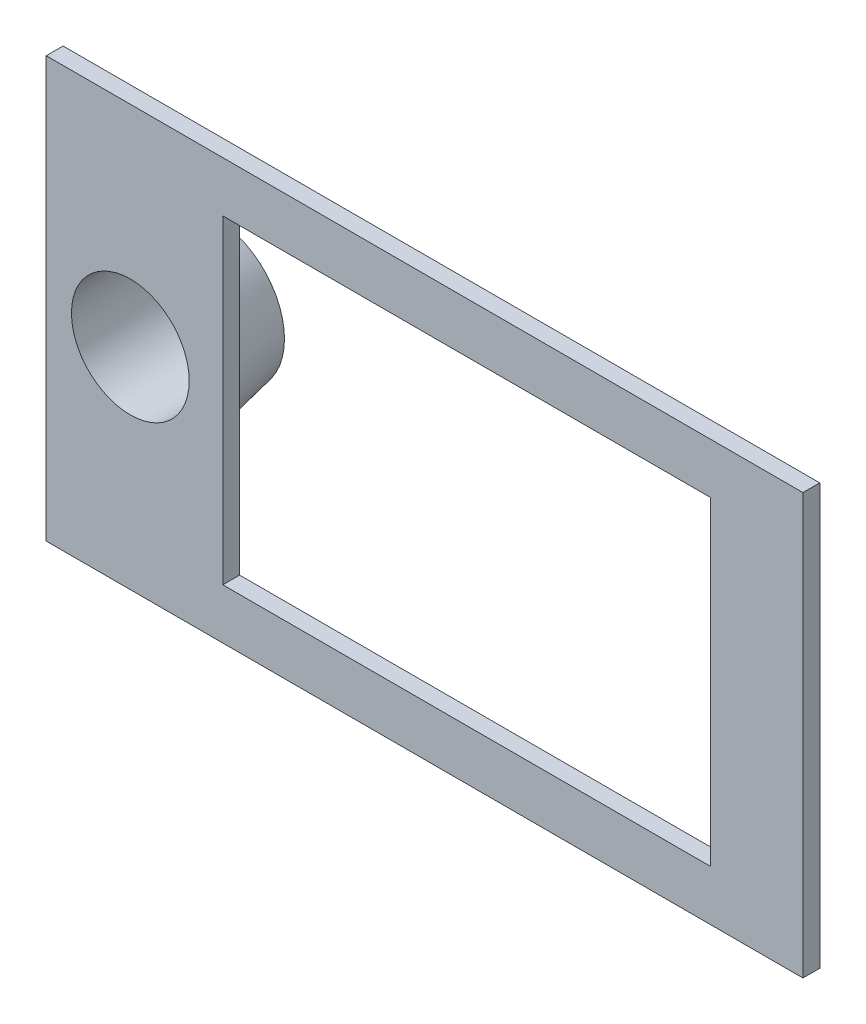
ISO-10303-21;
HEADER;
FILE_DESCRIPTION(('STEP AP214'),'2;1');
FILE_NAME('part.step','',(''),(''),'','','');
FILE_SCHEMA(('AUTOMOTIVE_DESIGN { 1 0 10303 214 1 1 1 1 }'));
ENDSEC;
DATA;
#1=APPLICATION_CONTEXT('core data for automotive mechanical design processes');
#2=APPLICATION_PROTOCOL_DEFINITION('international standard','automotive_design',2000,#1);
#3=PRODUCT_CONTEXT('',#1,'mechanical');
#4=PRODUCT('Part','Part','',(#3));
#5=PRODUCT_RELATED_PRODUCT_CATEGORY('part','',(#4));
#6=PRODUCT_DEFINITION_FORMATION('','',#4);
#7=PRODUCT_DEFINITION_CONTEXT('part definition',#1,'design');
#8=PRODUCT_DEFINITION('design','',#6,#7);
#9=PRODUCT_DEFINITION_SHAPE('','',#8);
#10=(LENGTH_UNIT() NAMED_UNIT(*) SI_UNIT(.MILLI.,.METRE.));
#11=(NAMED_UNIT(*) PLANE_ANGLE_UNIT() SI_UNIT($,.RADIAN.));
#12=(NAMED_UNIT(*) SI_UNIT($,.STERADIAN.) SOLID_ANGLE_UNIT());
#13=UNCERTAINTY_MEASURE_WITH_UNIT(LENGTH_MEASURE(1.E-05),#10,'distance_accuracy_value','');
#14=(GEOMETRIC_REPRESENTATION_CONTEXT(3) GLOBAL_UNCERTAINTY_ASSIGNED_CONTEXT((#13)) GLOBAL_UNIT_ASSIGNED_CONTEXT((#10,
#11,#12)) REPRESENTATION_CONTEXT('',''));
#15=CARTESIAN_POINT('',(0.,0.,0.));
#16=DIRECTION('',(0.,0.,1.));
#17=DIRECTION('',(1.,0.,0.));
#18=AXIS2_PLACEMENT_3D('',#15,#16,#17);
#19=CARTESIAN_POINT('',(0.,0.,823.316112651169));
#20=DIRECTION('',(0.,0.,-1.));
#21=DIRECTION('',(-1.,0.,0.));
#22=AXIS2_PLACEMENT_3D('',#19,#20,#21);
#23=PLANE('',#22);
#24=DIRECTION('',(-1.,0.,0.));
#25=VECTOR('',#24,1.);
#26=CARTESIAN_POINT('',(136.5,5.99999999999999,823.316112651169));
#27=LINE('',#26,#25);
#28=CARTESIAN_POINT('',(136.5,5.99999999999999,823.316112651169));
#29=VERTEX_POINT('',#28);
#30=CARTESIAN_POINT('',(49.5,5.99999999999999,823.316112651169));
#31=VERTEX_POINT('',#30);
#32=EDGE_CURVE('E115',#29,#31,#27,.T.);
#33=ORIENTED_EDGE('',*,*,#32,.F.);
#34=DIRECTION('',(0.,-1.,0.));
#35=VECTOR('',#34,1.);
#36=CARTESIAN_POINT('',(136.5,63.,823.316112651169));
#37=LINE('',#36,#35);
#38=CARTESIAN_POINT('',(136.5,63.,823.316112651169));
#39=VERTEX_POINT('',#38);
#40=EDGE_CURVE('E105',#39,#29,#37,.T.);
#41=ORIENTED_EDGE('',*,*,#40,.F.);
#42=DIRECTION('',(1.,0.,0.));
#43=VECTOR('',#42,1.);
#44=CARTESIAN_POINT('',(136.5,63.,823.316112651169));
#45=LINE('',#44,#43);
#46=CARTESIAN_POINT('',(49.5,63.,823.316112651169));
#47=VERTEX_POINT('',#46);
#48=EDGE_CURVE('E130',#47,#39,#45,.T.);
#49=ORIENTED_EDGE('',*,*,#48,.F.);
#50=DIRECTION('',(0.,1.,0.));
#51=VECTOR('',#50,1.);
#52=CARTESIAN_POINT('',(49.5,63.,823.316112651169));
#53=LINE('',#52,#51);
#54=EDGE_CURVE('E128',#31,#47,#53,.T.);
#55=ORIENTED_EDGE('',*,*,#54,.F.);
#56=EDGE_LOOP('',(#33,#41,#49,#55));
#57=FACE_BOUND('',#56,.T.);
#58=DIRECTION('',(0.,1.,0.));
#59=VECTOR('',#58,1.);
#60=CARTESIAN_POINT('',(18.,72.,823.316112651169));
#61=LINE('',#60,#59);
#62=CARTESIAN_POINT('',(18.,-3.,823.316112651169));
#63=VERTEX_POINT('',#62);
#64=CARTESIAN_POINT('',(18.,34.5,823.316112651169));
#65=VERTEX_POINT('',#64);
#66=EDGE_CURVE('E161',#63,#65,#61,.T.);
#67=ORIENTED_EDGE('',*,*,#66,.T.);
#68=CARTESIAN_POINT('',(33.,34.5,823.316112651169));
#69=DIRECTION('',(0.,0.,-1.));
#70=DIRECTION('',(-1.,0.,0.));
#71=AXIS2_PLACEMENT_3D('',#68,#69,#70);
#72=CIRCLE('',#71,15.);
#73=EDGE_CURVE('E50',#65,#65,#72,.T.);
#74=ORIENTED_EDGE('',*,*,#73,.F.);
#75=CARTESIAN_POINT('',(18.,72.,823.316112651169));
#76=VERTEX_POINT('',#75);
#77=EDGE_CURVE('E153',#65,#76,#61,.T.);
#78=ORIENTED_EDGE('',*,*,#77,.T.);
#79=DIRECTION('',(1.,0.,0.));
#80=VECTOR('',#79,1.);
#81=CARTESIAN_POINT('',(153.,72.,823.316112651169));
#82=LINE('',#81,#80);
#83=CARTESIAN_POINT('',(153.,72.,823.316112651169));
#84=VERTEX_POINT('',#83);
#85=EDGE_CURVE('E156',#76,#84,#82,.T.);
#86=ORIENTED_EDGE('',*,*,#85,.T.);
#87=DIRECTION('',(0.,-1.,0.));
#88=VECTOR('',#87,1.);
#89=CARTESIAN_POINT('',(153.,72.,823.316112651169));
#90=LINE('',#89,#88);
#91=CARTESIAN_POINT('',(153.,-3.,823.316112651169));
#92=VERTEX_POINT('',#91);
#93=EDGE_CURVE('E147',#84,#92,#90,.T.);
#94=ORIENTED_EDGE('',*,*,#93,.T.);
#95=DIRECTION('',(-1.,0.,0.));
#96=VECTOR('',#95,1.);
#97=CARTESIAN_POINT('',(153.,-3.,823.316112651169));
#98=LINE('',#97,#96);
#99=EDGE_CURVE('E150',#92,#63,#98,.T.);
#100=ORIENTED_EDGE('',*,*,#99,.T.);
#101=EDGE_LOOP('',(#67,#74,#78,#86,#94,#100));
#102=FACE_BOUND('',#101,.T.);
#103=ADVANCED_FACE('F35',(#57,#102),#23,.T.);
#104=CARTESIAN_POINT('',(0.,0.,826.316112651169));
#105=DIRECTION('',(0.,0.,-1.));
#106=DIRECTION('',(-1.,0.,0.));
#107=AXIS2_PLACEMENT_3D('',#104,#105,#106);
#108=PLANE('',#107);
#109=DIRECTION('',(0.,-1.,0.));
#110=VECTOR('',#109,1.);
#111=CARTESIAN_POINT('',(153.,72.,826.316112651169));
#112=LINE('',#111,#110);
#113=CARTESIAN_POINT('',(153.,72.,826.316112651169));
#114=VERTEX_POINT('',#113);
#115=CARTESIAN_POINT('',(153.,-3.,826.316112651169));
#116=VERTEX_POINT('',#115);
#117=EDGE_CURVE('E123',#114,#116,#112,.T.);
#118=ORIENTED_EDGE('',*,*,#117,.F.);
#119=DIRECTION('',(1.,0.,0.));
#120=VECTOR('',#119,1.);
#121=CARTESIAN_POINT('',(153.,72.,826.316112651169));
#122=LINE('',#121,#120);
#123=CARTESIAN_POINT('',(18.,72.,826.316112651169));
#124=VERTEX_POINT('',#123);
#125=EDGE_CURVE('E151',#124,#114,#122,.T.);
#126=ORIENTED_EDGE('',*,*,#125,.F.);
#127=DIRECTION('',(0.,1.,0.));
#128=VECTOR('',#127,1.);
#129=CARTESIAN_POINT('',(18.,72.,826.316112651169));
#130=LINE('',#129,#128);
#131=CARTESIAN_POINT('',(18.,-3.,826.316112651169));
#132=VERTEX_POINT('',#131);
#133=EDGE_CURVE('E251',#132,#124,#130,.T.);
#134=ORIENTED_EDGE('',*,*,#133,.F.);
#135=DIRECTION('',(-1.,0.,0.));
#136=VECTOR('',#135,1.);
#137=CARTESIAN_POINT('',(153.,-3.,826.316112651169));
#138=LINE('',#137,#136);
#139=EDGE_CURVE('E244',#116,#132,#138,.T.);
#140=ORIENTED_EDGE('',*,*,#139,.F.);
#141=EDGE_LOOP('',(#118,#126,#134,#140));
#142=FACE_BOUND('',#141,.T.);
#143=DIRECTION('',(0.,-1.,0.));
#144=VECTOR('',#143,1.);
#145=CARTESIAN_POINT('',(136.5,63.,826.316112651169));
#146=LINE('',#145,#144);
#147=CARTESIAN_POINT('',(136.5,63.,826.316112651169));
#148=VERTEX_POINT('',#147);
#149=CARTESIAN_POINT('',(136.5,5.99999999999999,826.316112651169));
#150=VERTEX_POINT('',#149);
#151=EDGE_CURVE('E135',#148,#150,#146,.T.);
#152=ORIENTED_EDGE('',*,*,#151,.T.);
#153=DIRECTION('',(-1.,0.,0.));
#154=VECTOR('',#153,1.);
#155=CARTESIAN_POINT('',(136.5,5.99999999999999,826.316112651169));
#156=LINE('',#155,#154);
#157=CARTESIAN_POINT('',(49.5,5.99999999999999,826.316112651169));
#158=VERTEX_POINT('',#157);
#159=EDGE_CURVE('E122',#150,#158,#156,.T.);
#160=ORIENTED_EDGE('',*,*,#159,.T.);
#161=DIRECTION('',(0.,1.,0.));
#162=VECTOR('',#161,1.);
#163=CARTESIAN_POINT('',(49.5,63.,826.316112651169));
#164=LINE('',#163,#162);
#165=CARTESIAN_POINT('',(49.5,63.,826.316112651169));
#166=VERTEX_POINT('',#165);
#167=EDGE_CURVE('E139',#158,#166,#164,.T.);
#168=ORIENTED_EDGE('',*,*,#167,.T.);
#169=DIRECTION('',(1.,0.,0.));
#170=VECTOR('',#169,1.);
#171=CARTESIAN_POINT('',(136.5,63.,826.316112651169));
#172=LINE('',#171,#170);
#173=EDGE_CURVE('E116',#166,#148,#172,.T.);
#174=ORIENTED_EDGE('',*,*,#173,.T.);
#175=EDGE_LOOP('',(#152,#160,#168,#174));
#176=FACE_BOUND('',#175,.T.);
#177=CARTESIAN_POINT('',(33.,34.5,826.316112651169));
#178=DIRECTION('',(0.,0.,-1.));
#179=DIRECTION('',(-1.,0.,0.));
#180=AXIS2_PLACEMENT_3D('',#177,#178,#179);
#181=CIRCLE('',#180,10.5);
#182=CARTESIAN_POINT('',(22.5,34.5,826.316112651169));
#183=VERTEX_POINT('',#182);
#184=EDGE_CURVE('E137',#183,#183,#181,.T.);
#185=ORIENTED_EDGE('',*,*,#184,.T.);
#186=EDGE_LOOP('',(#185));
#187=FACE_BOUND('',#186,.T.);
#188=ADVANCED_FACE('F207',(#142,#176,#187),#108,.F.);
#189=CARTESIAN_POINT('',(153.,72.,823.316112651169));
#190=DIRECTION('',(-1.,0.,0.));
#191=DIRECTION('',(0.,0.,1.));
#192=AXIS2_PLACEMENT_3D('',#189,#190,#191);
#193=PLANE('',#192);
#194=ORIENTED_EDGE('',*,*,#117,.T.);
#195=DIRECTION('',(0.,0.,1.));
#196=VECTOR('',#195,1.);
#197=CARTESIAN_POINT('',(153.,-3.,823.316112651169));
#198=LINE('',#197,#196);
#199=EDGE_CURVE('E12',#92,#116,#198,.T.);
#200=ORIENTED_EDGE('',*,*,#199,.F.);
#201=ORIENTED_EDGE('',*,*,#93,.F.);
#202=DIRECTION('',(0.,0.,1.));
#203=VECTOR('',#202,1.);
#204=CARTESIAN_POINT('',(153.,72.,823.316112651169));
#205=LINE('',#204,#203);
#206=EDGE_CURVE('E263',#84,#114,#205,.T.);
#207=ORIENTED_EDGE('',*,*,#206,.T.);
#208=EDGE_LOOP('',(#194,#200,#201,#207));
#209=FACE_BOUND('',#208,.T.);
#210=ADVANCED_FACE('F37',(#209),#193,.F.);
#211=CARTESIAN_POINT('',(153.,-3.,823.316112651169));
#212=DIRECTION('',(0.,1.,0.));
#213=DIRECTION('',(0.,0.,1.));
#214=AXIS2_PLACEMENT_3D('',#211,#212,#213);
#215=PLANE('',#214);
#216=ORIENTED_EDGE('',*,*,#139,.T.);
#217=DIRECTION('',(0.,0.,1.));
#218=VECTOR('',#217,1.);
#219=CARTESIAN_POINT('',(18.,-3.,823.316112651169));
#220=LINE('',#219,#218);
#221=EDGE_CURVE('E44',#63,#132,#220,.T.);
#222=ORIENTED_EDGE('',*,*,#221,.F.);
#223=ORIENTED_EDGE('',*,*,#99,.F.);
#224=ORIENTED_EDGE('',*,*,#199,.T.);
#225=EDGE_LOOP('',(#216,#222,#223,#224));
#226=FACE_BOUND('',#225,.T.);
#227=ADVANCED_FACE('F234',(#226),#215,.F.);
#228=CARTESIAN_POINT('',(18.,72.,823.316112651169));
#229=DIRECTION('',(1.,0.,0.));
#230=DIRECTION('',(0.,0.,-1.));
#231=AXIS2_PLACEMENT_3D('',#228,#229,#230);
#232=PLANE('',#231);
#233=ORIENTED_EDGE('',*,*,#133,.T.);
#234=DIRECTION('',(0.,0.,1.));
#235=VECTOR('',#234,1.);
#236=CARTESIAN_POINT('',(18.,72.,823.316112651169));
#237=LINE('',#236,#235);
#238=EDGE_CURVE('E256',#76,#124,#237,.T.);
#239=ORIENTED_EDGE('',*,*,#238,.F.);
#240=ORIENTED_EDGE('',*,*,#77,.F.);
#241=ORIENTED_EDGE('',*,*,#66,.F.);
#242=ORIENTED_EDGE('',*,*,#221,.T.);
#243=EDGE_LOOP('',(#233,#239,#240,#241,#242));
#244=FACE_BOUND('',#243,.T.);
#245=ADVANCED_FACE('F232',(#244),#232,.F.);
#246=CARTESIAN_POINT('',(153.,72.,823.316112651169));
#247=DIRECTION('',(0.,-1.,0.));
#248=DIRECTION('',(0.,0.,-1.));
#249=AXIS2_PLACEMENT_3D('',#246,#247,#248);
#250=PLANE('',#249);
#251=ORIENTED_EDGE('',*,*,#125,.T.);
#252=ORIENTED_EDGE('',*,*,#206,.F.);
#253=ORIENTED_EDGE('',*,*,#85,.F.);
#254=ORIENTED_EDGE('',*,*,#238,.T.);
#255=EDGE_LOOP('',(#251,#252,#253,#254));
#256=FACE_BOUND('',#255,.T.);
#257=ADVANCED_FACE('F229',(#256),#250,.F.);
#258=CARTESIAN_POINT('',(136.5,63.,823.316112651169));
#259=DIRECTION('',(-1.,0.,0.));
#260=DIRECTION('',(0.,0.,1.));
#261=AXIS2_PLACEMENT_3D('',#258,#259,#260);
#262=PLANE('',#261);
#263=ORIENTED_EDGE('',*,*,#151,.F.);
#264=DIRECTION('',(0.,0.,1.));
#265=VECTOR('',#264,1.);
#266=CARTESIAN_POINT('',(136.5,63.,823.316112651169));
#267=LINE('',#266,#265);
#268=EDGE_CURVE('E111',#39,#148,#267,.T.);
#269=ORIENTED_EDGE('',*,*,#268,.F.);
#270=ORIENTED_EDGE('',*,*,#40,.T.);
#271=DIRECTION('',(0.,0.,1.));
#272=VECTOR('',#271,1.);
#273=CARTESIAN_POINT('',(136.5,5.99999999999999,823.316112651169));
#274=LINE('',#273,#272);
#275=EDGE_CURVE('E108',#29,#150,#274,.T.);
#276=ORIENTED_EDGE('',*,*,#275,.T.);
#277=EDGE_LOOP('',(#263,#269,#270,#276));
#278=FACE_BOUND('',#277,.T.);
#279=ADVANCED_FACE('F107',(#278),#262,.T.);
#280=CARTESIAN_POINT('',(136.5,5.99999999999999,823.316112651169));
#281=DIRECTION('',(0.,1.,0.));
#282=DIRECTION('',(0.,0.,1.));
#283=AXIS2_PLACEMENT_3D('',#280,#281,#282);
#284=PLANE('',#283);
#285=ORIENTED_EDGE('',*,*,#159,.F.);
#286=ORIENTED_EDGE('',*,*,#275,.F.);
#287=ORIENTED_EDGE('',*,*,#32,.T.);
#288=DIRECTION('',(0.,0.,1.));
#289=VECTOR('',#288,1.);
#290=CARTESIAN_POINT('',(49.5,5.99999999999999,823.316112651169));
#291=LINE('',#290,#289);
#292=EDGE_CURVE('E124',#31,#158,#291,.T.);
#293=ORIENTED_EDGE('',*,*,#292,.T.);
#294=EDGE_LOOP('',(#285,#286,#287,#293));
#295=FACE_BOUND('',#294,.T.);
#296=ADVANCED_FACE('F119',(#295),#284,.T.);
#297=CARTESIAN_POINT('',(49.5,63.,823.316112651169));
#298=DIRECTION('',(1.,0.,0.));
#299=DIRECTION('',(0.,0.,-1.));
#300=AXIS2_PLACEMENT_3D('',#297,#298,#299);
#301=PLANE('',#300);
#302=ORIENTED_EDGE('',*,*,#167,.F.);
#303=ORIENTED_EDGE('',*,*,#292,.F.);
#304=ORIENTED_EDGE('',*,*,#54,.T.);
#305=DIRECTION('',(0.,0.,1.));
#306=VECTOR('',#305,1.);
#307=CARTESIAN_POINT('',(49.5,63.,823.316112651169));
#308=LINE('',#307,#306);
#309=EDGE_CURVE('E57',#47,#166,#308,.T.);
#310=ORIENTED_EDGE('',*,*,#309,.T.);
#311=EDGE_LOOP('',(#302,#303,#304,#310));
#312=FACE_BOUND('',#311,.T.);
#313=ADVANCED_FACE('F216',(#312),#301,.T.);
#314=CARTESIAN_POINT('',(136.5,63.,823.316112651169));
#315=DIRECTION('',(0.,-1.,0.));
#316=DIRECTION('',(0.,0.,-1.));
#317=AXIS2_PLACEMENT_3D('',#314,#315,#316);
#318=PLANE('',#317);
#319=ORIENTED_EDGE('',*,*,#173,.F.);
#320=ORIENTED_EDGE('',*,*,#309,.F.);
#321=ORIENTED_EDGE('',*,*,#48,.T.);
#322=ORIENTED_EDGE('',*,*,#268,.T.);
#323=EDGE_LOOP('',(#319,#320,#321,#322));
#324=FACE_BOUND('',#323,.T.);
#325=ADVANCED_FACE('F211',(#324),#318,.T.);
#326=CARTESIAN_POINT('',(33.,34.5,823.316112651169));
#327=DIRECTION('',(0.,0.,1.));
#328=DIRECTION('',(1.,0.,0.));
#329=AXIS2_PLACEMENT_3D('',#326,#327,#328);
#330=CYLINDRICAL_SURFACE('',#329,10.5);
#331=ORIENTED_EDGE('',*,*,#184,.F.);
#332=EDGE_LOOP('',(#331));
#333=FACE_BOUND('',#332,.T.);
#334=CARTESIAN_POINT('',(33.,34.5,811.316112651169));
#335=DIRECTION('',(0.,0.,1.));
#336=DIRECTION('',(1.,0.,0.));
#337=AXIS2_PLACEMENT_3D('',#334,#335,#336);
#338=CIRCLE('',#337,10.5);
#339=CARTESIAN_POINT('',(43.5,34.5,811.316112651169));
#340=VERTEX_POINT('',#339);
#341=EDGE_CURVE('E164',#340,#340,#338,.T.);
#342=ORIENTED_EDGE('',*,*,#341,.F.);
#343=EDGE_LOOP('',(#342));
#344=FACE_BOUND('',#343,.T.);
#345=ADVANCED_FACE('F190',(#333,#344),#330,.F.);
#346=CARTESIAN_POINT('',(33.,34.5,811.316112651169));
#347=DIRECTION('',(0.,0.,1.));
#348=DIRECTION('',(1.,0.,0.));
#349=AXIS2_PLACEMENT_3D('',#346,#347,#348);
#350=CONICAL_SURFACE('',#349,12.5,0.205395389189768);
#351=ORIENTED_EDGE('',*,*,#73,.T.);
#352=EDGE_LOOP('',(#351));
#353=FACE_BOUND('',#352,.T.);
#354=CARTESIAN_POINT('',(33.,34.5,811.316112651169));
#355=DIRECTION('',(0.,0.,1.));
#356=DIRECTION('',(1.,0.,0.));
#357=AXIS2_PLACEMENT_3D('',#354,#355,#356);
#358=CIRCLE('',#357,12.5);
#359=CARTESIAN_POINT('',(45.5,34.5,811.316112651169));
#360=VERTEX_POINT('',#359);
#361=EDGE_CURVE('E163',#360,#360,#358,.T.);
#362=ORIENTED_EDGE('',*,*,#361,.T.);
#363=EDGE_LOOP('',(#362));
#364=FACE_BOUND('',#363,.T.);
#365=ADVANCED_FACE('F180',(#353,#364),#350,.T.);
#366=CARTESIAN_POINT('',(33.,34.5,811.316112651169));
#367=DIRECTION('',(0.,0.,1.));
#368=DIRECTION('',(1.,0.,0.));
#369=AXIS2_PLACEMENT_3D('',#366,#367,#368);
#370=PLANE('',#369);
#371=ORIENTED_EDGE('',*,*,#341,.T.);
#372=EDGE_LOOP('',(#371));
#373=FACE_BOUND('',#372,.T.);
#374=ORIENTED_EDGE('',*,*,#361,.F.);
#375=EDGE_LOOP('',(#374));
#376=FACE_BOUND('',#375,.T.);
#377=ADVANCED_FACE('F189',(#373,#376),#370,.F.);
#378=CLOSED_SHELL('',(#103,#188,#210,#227,#245,#257,#279,#296,#313,#325,#345,#365,#377));
#379=MANIFOLD_SOLID_BREP('B2',#378);
#380=ADVANCED_BREP_SHAPE_REPRESENTATION('',(#18,#379),#14);
#381=SHAPE_DEFINITION_REPRESENTATION(#9,#380);
ENDSEC;
END-ISO-10303-21;
